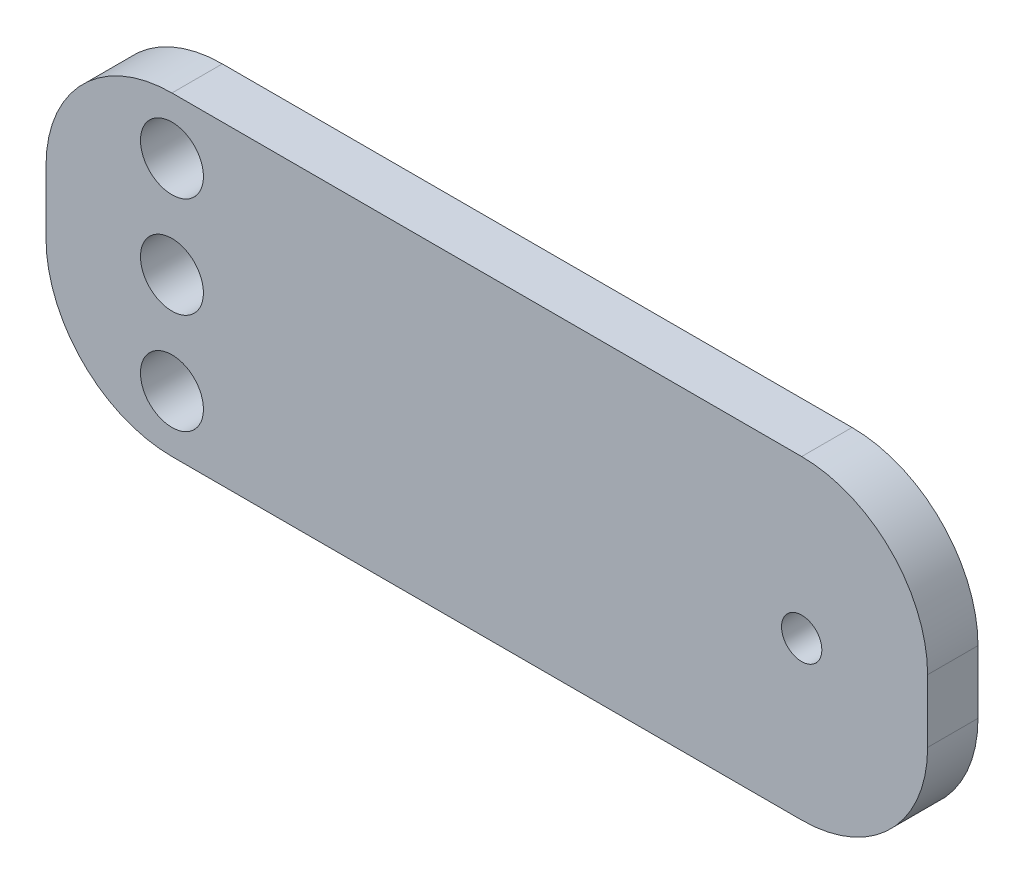
ISO-10303-21;
HEADER;
FILE_DESCRIPTION(('STEP AP214'),'2;1');
FILE_NAME('part.step','',(''),(''),'','','');
FILE_SCHEMA(('AUTOMOTIVE_DESIGN { 1 0 10303 214 1 1 1 1 }'));
ENDSEC;
DATA;
#1=APPLICATION_CONTEXT('core data for automotive mechanical design processes');
#2=APPLICATION_PROTOCOL_DEFINITION('international standard','automotive_design',2000,#1);
#3=PRODUCT_CONTEXT('',#1,'mechanical');
#4=PRODUCT('Part','Part','',(#3));
#5=PRODUCT_RELATED_PRODUCT_CATEGORY('part','',(#4));
#6=PRODUCT_DEFINITION_FORMATION('','',#4);
#7=PRODUCT_DEFINITION_CONTEXT('part definition',#1,'design');
#8=PRODUCT_DEFINITION('design','',#6,#7);
#9=PRODUCT_DEFINITION_SHAPE('','',#8);
#10=(LENGTH_UNIT() NAMED_UNIT(*) SI_UNIT(.MILLI.,.METRE.));
#11=(NAMED_UNIT(*) PLANE_ANGLE_UNIT() SI_UNIT($,.RADIAN.));
#12=(NAMED_UNIT(*) SI_UNIT($,.STERADIAN.) SOLID_ANGLE_UNIT());
#13=UNCERTAINTY_MEASURE_WITH_UNIT(LENGTH_MEASURE(1.E-05),#10,'distance_accuracy_value','');
#14=(GEOMETRIC_REPRESENTATION_CONTEXT(3) GLOBAL_UNCERTAINTY_ASSIGNED_CONTEXT((#13)) GLOBAL_UNIT_ASSIGNED_CONTEXT((#10,
#11,#12)) REPRESENTATION_CONTEXT('',''));
#15=CARTESIAN_POINT('',(0.,0.,0.));
#16=DIRECTION('',(0.,0.,1.));
#17=DIRECTION('',(1.,0.,0.));
#18=AXIS2_PLACEMENT_3D('',#15,#16,#17);
#19=CARTESIAN_POINT('',(0.,0.,4.));
#20=DIRECTION('',(0.,0.,-1.));
#21=DIRECTION('',(-1.,0.,0.));
#22=AXIS2_PLACEMENT_3D('',#19,#20,#21);
#23=PLANE('',#22);
#24=CARTESIAN_POINT('',(-25.,8.,4.));
#25=DIRECTION('',(0.,0.,1.));
#26=DIRECTION('',(1.,0.,0.));
#27=AXIS2_PLACEMENT_3D('',#24,#25,#26);
#28=CIRCLE('',#27,2.5);
#29=CARTESIAN_POINT('',(-22.5,8.,4.));
#30=VERTEX_POINT('',#29);
#31=EDGE_CURVE('E189',#30,#30,#28,.T.);
#32=ORIENTED_EDGE('',*,*,#31,.F.);
#33=EDGE_LOOP('',(#32));
#34=FACE_BOUND('',#33,.T.);
#35=CARTESIAN_POINT('',(-25.,0.,4.));
#36=DIRECTION('',(0.,0.,1.));
#37=DIRECTION('',(1.,0.,0.));
#38=AXIS2_PLACEMENT_3D('',#35,#36,#37);
#39=CIRCLE('',#38,2.5);
#40=CARTESIAN_POINT('',(-22.5,0.,4.));
#41=VERTEX_POINT('',#40);
#42=EDGE_CURVE('E175',#41,#41,#39,.T.);
#43=ORIENTED_EDGE('',*,*,#42,.F.);
#44=EDGE_LOOP('',(#43));
#45=FACE_BOUND('',#44,.T.);
#46=DIRECTION('',(-1.,0.,0.));
#47=VECTOR('',#46,1.);
#48=CARTESIAN_POINT('',(-35.,12.5,4.));
#49=LINE('',#48,#47);
#50=CARTESIAN_POINT('',(25.,12.5,4.));
#51=VERTEX_POINT('',#50);
#52=CARTESIAN_POINT('',(-25.,12.5,4.));
#53=VERTEX_POINT('',#52);
#54=EDGE_CURVE('E170',#51,#53,#49,.T.);
#55=ORIENTED_EDGE('',*,*,#54,.T.);
#56=CARTESIAN_POINT('',(-25.,2.49999999999999,4.));
#57=DIRECTION('',(0.,0.,-1.));
#58=DIRECTION('',(-1.,0.,0.));
#59=AXIS2_PLACEMENT_3D('',#56,#57,#58);
#60=CIRCLE('',#59,10.);
#61=CARTESIAN_POINT('',(-35.,2.49999999999999,4.));
#62=VERTEX_POINT('',#61);
#63=EDGE_CURVE('E151',#53,#62,#60,.F.);
#64=ORIENTED_EDGE('',*,*,#63,.T.);
#65=DIRECTION('',(0.,-1.,0.));
#66=VECTOR('',#65,1.);
#67=CARTESIAN_POINT('',(-35.,-12.5,4.));
#68=LINE('',#67,#66);
#69=CARTESIAN_POINT('',(-35.,-2.49999999999998,4.));
#70=VERTEX_POINT('',#69);
#71=EDGE_CURVE('E121',#62,#70,#68,.T.);
#72=ORIENTED_EDGE('',*,*,#71,.T.);
#73=CARTESIAN_POINT('',(-25.,-2.49999999999999,4.));
#74=DIRECTION('',(0.,0.,-1.));
#75=DIRECTION('',(-1.,0.,0.));
#76=AXIS2_PLACEMENT_3D('',#73,#74,#75);
#77=CIRCLE('',#76,10.);
#78=CARTESIAN_POINT('',(-25.,-12.5,4.));
#79=VERTEX_POINT('',#78);
#80=EDGE_CURVE('E57',#70,#79,#77,.F.);
#81=ORIENTED_EDGE('',*,*,#80,.T.);
#82=DIRECTION('',(1.,0.,0.));
#83=VECTOR('',#82,1.);
#84=CARTESIAN_POINT('',(-35.,-12.5,4.));
#85=LINE('',#84,#83);
#86=CARTESIAN_POINT('',(25.,-12.5,4.));
#87=VERTEX_POINT('',#86);
#88=EDGE_CURVE('E137',#79,#87,#85,.T.);
#89=ORIENTED_EDGE('',*,*,#88,.T.);
#90=CARTESIAN_POINT('',(25.,-2.5,4.));
#91=DIRECTION('',(0.,0.,-1.));
#92=DIRECTION('',(-1.,0.,0.));
#93=AXIS2_PLACEMENT_3D('',#90,#91,#92);
#94=CIRCLE('',#93,10.);
#95=CARTESIAN_POINT('',(35.,-2.5,4.));
#96=VERTEX_POINT('',#95);
#97=EDGE_CURVE('E148',#87,#96,#94,.F.);
#98=ORIENTED_EDGE('',*,*,#97,.T.);
#99=DIRECTION('',(0.,1.,0.));
#100=VECTOR('',#99,1.);
#101=CARTESIAN_POINT('',(35.,-12.5,4.));
#102=LINE('',#101,#100);
#103=CARTESIAN_POINT('',(35.,2.5,4.));
#104=VERTEX_POINT('',#103);
#105=EDGE_CURVE('E131',#96,#104,#102,.T.);
#106=ORIENTED_EDGE('',*,*,#105,.T.);
#107=CARTESIAN_POINT('',(25.,2.5,4.));
#108=DIRECTION('',(0.,0.,-1.));
#109=DIRECTION('',(-1.,0.,0.));
#110=AXIS2_PLACEMENT_3D('',#107,#108,#109);
#111=CIRCLE('',#110,10.);
#112=EDGE_CURVE('E146',#104,#51,#111,.F.);
#113=ORIENTED_EDGE('',*,*,#112,.T.);
#114=EDGE_LOOP('',(#55,#64,#72,#81,#89,#98,#106,#113));
#115=FACE_BOUND('',#114,.T.);
#116=CARTESIAN_POINT('',(25.,0.,4.));
#117=DIRECTION('',(0.,0.,1.));
#118=DIRECTION('',(1.,0.,0.));
#119=AXIS2_PLACEMENT_3D('',#116,#117,#118);
#120=CIRCLE('',#119,1.6);
#121=CARTESIAN_POINT('',(26.6,0.,4.));
#122=VERTEX_POINT('',#121);
#123=EDGE_CURVE('E184',#122,#122,#120,.T.);
#124=ORIENTED_EDGE('',*,*,#123,.F.);
#125=EDGE_LOOP('',(#124));
#126=FACE_BOUND('',#125,.T.);
#127=CARTESIAN_POINT('',(-25.,-8.,4.));
#128=DIRECTION('',(0.,0.,1.));
#129=DIRECTION('',(1.,0.,0.));
#130=AXIS2_PLACEMENT_3D('',#127,#128,#129);
#131=CIRCLE('',#130,2.5);
#132=CARTESIAN_POINT('',(-22.5,-8.,4.));
#133=VERTEX_POINT('',#132);
#134=EDGE_CURVE('E195',#133,#133,#131,.T.);
#135=ORIENTED_EDGE('',*,*,#134,.F.);
#136=EDGE_LOOP('',(#135));
#137=FACE_BOUND('',#136,.T.);
#138=ADVANCED_FACE('F35',(#34,#45,#115,#126,#137),#23,.F.);
#139=CARTESIAN_POINT('',(0.,0.,0.));
#140=DIRECTION('',(0.,0.,-1.));
#141=DIRECTION('',(-1.,0.,0.));
#142=AXIS2_PLACEMENT_3D('',#139,#140,#141);
#143=PLANE('',#142);
#144=CARTESIAN_POINT('',(-25.,8.,0.));
#145=DIRECTION('',(0.,0.,1.));
#146=DIRECTION('',(1.,0.,0.));
#147=AXIS2_PLACEMENT_3D('',#144,#145,#146);
#148=CIRCLE('',#147,2.5);
#149=CARTESIAN_POINT('',(-22.5,8.,0.));
#150=VERTEX_POINT('',#149);
#151=EDGE_CURVE('E192',#150,#150,#148,.T.);
#152=ORIENTED_EDGE('',*,*,#151,.T.);
#153=EDGE_LOOP('',(#152));
#154=FACE_BOUND('',#153,.T.);
#155=CARTESIAN_POINT('',(-25.,0.,0.));
#156=DIRECTION('',(0.,0.,1.));
#157=DIRECTION('',(1.,0.,0.));
#158=AXIS2_PLACEMENT_3D('',#155,#156,#157);
#159=CIRCLE('',#158,2.5);
#160=CARTESIAN_POINT('',(-22.5,0.,0.));
#161=VERTEX_POINT('',#160);
#162=EDGE_CURVE('E177',#161,#161,#159,.T.);
#163=ORIENTED_EDGE('',*,*,#162,.T.);
#164=EDGE_LOOP('',(#163));
#165=FACE_BOUND('',#164,.T.);
#166=DIRECTION('',(0.,-1.,0.));
#167=VECTOR('',#166,1.);
#168=CARTESIAN_POINT('',(-35.,-12.5,0.));
#169=LINE('',#168,#167);
#170=CARTESIAN_POINT('',(-35.,2.49999999999999,0.));
#171=VERTEX_POINT('',#170);
#172=CARTESIAN_POINT('',(-35.,-2.49999999999998,0.));
#173=VERTEX_POINT('',#172);
#174=EDGE_CURVE('E119',#171,#173,#169,.T.);
#175=ORIENTED_EDGE('',*,*,#174,.F.);
#176=CARTESIAN_POINT('',(-25.,2.49999999999999,0.));
#177=DIRECTION('',(0.,0.,-1.));
#178=DIRECTION('',(-1.,0.,0.));
#179=AXIS2_PLACEMENT_3D('',#176,#177,#178);
#180=CIRCLE('',#179,10.);
#181=CARTESIAN_POINT('',(-25.,12.5,0.));
#182=VERTEX_POINT('',#181);
#183=EDGE_CURVE('E102',#171,#182,#180,.T.);
#184=ORIENTED_EDGE('',*,*,#183,.T.);
#185=DIRECTION('',(-1.,0.,0.));
#186=VECTOR('',#185,1.);
#187=CARTESIAN_POINT('',(-35.,12.5,0.));
#188=LINE('',#187,#186);
#189=CARTESIAN_POINT('',(25.,12.5,0.));
#190=VERTEX_POINT('',#189);
#191=EDGE_CURVE('E129',#190,#182,#188,.T.);
#192=ORIENTED_EDGE('',*,*,#191,.F.);
#193=CARTESIAN_POINT('',(25.,2.5,0.));
#194=DIRECTION('',(0.,0.,-1.));
#195=DIRECTION('',(-1.,0.,0.));
#196=AXIS2_PLACEMENT_3D('',#193,#194,#195);
#197=CIRCLE('',#196,10.);
#198=CARTESIAN_POINT('',(35.,2.5,0.));
#199=VERTEX_POINT('',#198);
#200=EDGE_CURVE('E122',#190,#199,#197,.T.);
#201=ORIENTED_EDGE('',*,*,#200,.T.);
#202=DIRECTION('',(0.,1.,0.));
#203=VECTOR('',#202,1.);
#204=CARTESIAN_POINT('',(35.,-12.5,0.));
#205=LINE('',#204,#203);
#206=CARTESIAN_POINT('',(35.,-2.5,0.));
#207=VERTEX_POINT('',#206);
#208=EDGE_CURVE('E133',#207,#199,#205,.T.);
#209=ORIENTED_EDGE('',*,*,#208,.F.);
#210=CARTESIAN_POINT('',(25.,-2.5,0.));
#211=DIRECTION('',(0.,0.,-1.));
#212=DIRECTION('',(-1.,0.,0.));
#213=AXIS2_PLACEMENT_3D('',#210,#211,#212);
#214=CIRCLE('',#213,10.);
#215=CARTESIAN_POINT('',(25.,-12.5,0.));
#216=VERTEX_POINT('',#215);
#217=EDGE_CURVE('E140',#207,#216,#214,.T.);
#218=ORIENTED_EDGE('',*,*,#217,.T.);
#219=DIRECTION('',(1.,0.,0.));
#220=VECTOR('',#219,1.);
#221=CARTESIAN_POINT('',(-35.,-12.5,0.));
#222=LINE('',#221,#220);
#223=CARTESIAN_POINT('',(-25.,-12.5,0.));
#224=VERTEX_POINT('',#223);
#225=EDGE_CURVE('E128',#224,#216,#222,.T.);
#226=ORIENTED_EDGE('',*,*,#225,.F.);
#227=CARTESIAN_POINT('',(-25.,-2.49999999999999,0.));
#228=DIRECTION('',(0.,0.,-1.));
#229=DIRECTION('',(-1.,0.,0.));
#230=AXIS2_PLACEMENT_3D('',#227,#228,#229);
#231=CIRCLE('',#230,10.);
#232=EDGE_CURVE('E113',#224,#173,#231,.T.);
#233=ORIENTED_EDGE('',*,*,#232,.T.);
#234=EDGE_LOOP('',(#175,#184,#192,#201,#209,#218,#226,#233));
#235=FACE_BOUND('',#234,.T.);
#236=CARTESIAN_POINT('',(25.,0.,0.));
#237=DIRECTION('',(0.,0.,1.));
#238=DIRECTION('',(1.,0.,0.));
#239=AXIS2_PLACEMENT_3D('',#236,#237,#238);
#240=CIRCLE('',#239,1.6);
#241=CARTESIAN_POINT('',(26.6,0.,0.));
#242=VERTEX_POINT('',#241);
#243=EDGE_CURVE('E186',#242,#242,#240,.T.);
#244=ORIENTED_EDGE('',*,*,#243,.T.);
#245=EDGE_LOOP('',(#244));
#246=FACE_BOUND('',#245,.T.);
#247=CARTESIAN_POINT('',(-25.,-8.,0.));
#248=DIRECTION('',(0.,0.,1.));
#249=DIRECTION('',(1.,0.,0.));
#250=AXIS2_PLACEMENT_3D('',#247,#248,#249);
#251=CIRCLE('',#250,2.5);
#252=CARTESIAN_POINT('',(-22.5,-8.,0.));
#253=VERTEX_POINT('',#252);
#254=EDGE_CURVE('E198',#253,#253,#251,.T.);
#255=ORIENTED_EDGE('',*,*,#254,.T.);
#256=EDGE_LOOP('',(#255));
#257=FACE_BOUND('',#256,.T.);
#258=ADVANCED_FACE('F125',(#154,#165,#235,#246,#257),#143,.T.);
#259=CARTESIAN_POINT('',(35.,-12.5,4.));
#260=DIRECTION('',(-1.,0.,0.));
#261=DIRECTION('',(0.,0.,1.));
#262=AXIS2_PLACEMENT_3D('',#259,#260,#261);
#263=PLANE('',#262);
#264=ORIENTED_EDGE('',*,*,#105,.F.);
#265=DIRECTION('',(0.,0.,-1.));
#266=VECTOR('',#265,1.);
#267=CARTESIAN_POINT('',(35.,-2.5,4.));
#268=LINE('',#267,#266);
#269=EDGE_CURVE('E11',#96,#207,#268,.T.);
#270=ORIENTED_EDGE('',*,*,#269,.T.);
#271=ORIENTED_EDGE('',*,*,#208,.T.);
#272=DIRECTION('',(0.,0.,-1.));
#273=VECTOR('',#272,1.);
#274=CARTESIAN_POINT('',(35.,2.5,4.));
#275=LINE('',#274,#273);
#276=EDGE_CURVE('E43',#199,#104,#275,.F.);
#277=ORIENTED_EDGE('',*,*,#276,.T.);
#278=EDGE_LOOP('',(#264,#270,#271,#277));
#279=FACE_BOUND('',#278,.T.);
#280=ADVANCED_FACE('F161',(#279),#263,.F.);
#281=CARTESIAN_POINT('',(-35.,12.5,4.));
#282=DIRECTION('',(0.,-1.,0.));
#283=DIRECTION('',(1.,0.,0.));
#284=AXIS2_PLACEMENT_3D('',#281,#282,#283);
#285=PLANE('',#284);
#286=ORIENTED_EDGE('',*,*,#191,.T.);
#287=DIRECTION('',(0.,0.,-1.));
#288=VECTOR('',#287,1.);
#289=CARTESIAN_POINT('',(-25.,12.5,4.));
#290=LINE('',#289,#288);
#291=EDGE_CURVE('E107',#182,#53,#290,.F.);
#292=ORIENTED_EDGE('',*,*,#291,.T.);
#293=ORIENTED_EDGE('',*,*,#54,.F.);
#294=DIRECTION('',(0.,0.,-1.));
#295=VECTOR('',#294,1.);
#296=CARTESIAN_POINT('',(25.,12.5,4.));
#297=LINE('',#296,#295);
#298=EDGE_CURVE('E112',#51,#190,#297,.T.);
#299=ORIENTED_EDGE('',*,*,#298,.T.);
#300=EDGE_LOOP('',(#286,#292,#293,#299));
#301=FACE_BOUND('',#300,.T.);
#302=ADVANCED_FACE('F174',(#301),#285,.F.);
#303=CARTESIAN_POINT('',(-35.,-12.5,4.));
#304=DIRECTION('',(1.,0.,0.));
#305=DIRECTION('',(0.,0.,-1.));
#306=AXIS2_PLACEMENT_3D('',#303,#304,#305);
#307=PLANE('',#306);
#308=ORIENTED_EDGE('',*,*,#71,.F.);
#309=DIRECTION('',(0.,0.,-1.));
#310=VECTOR('',#309,1.);
#311=CARTESIAN_POINT('',(-35.,2.49999999999999,4.));
#312=LINE('',#311,#310);
#313=EDGE_CURVE('E106',#62,#171,#312,.T.);
#314=ORIENTED_EDGE('',*,*,#313,.T.);
#315=ORIENTED_EDGE('',*,*,#174,.T.);
#316=DIRECTION('',(0.,0.,-1.));
#317=VECTOR('',#316,1.);
#318=CARTESIAN_POINT('',(-35.,-2.49999999999998,4.));
#319=LINE('',#318,#317);
#320=EDGE_CURVE('E123',#173,#70,#319,.F.);
#321=ORIENTED_EDGE('',*,*,#320,.T.);
#322=EDGE_LOOP('',(#308,#314,#315,#321));
#323=FACE_BOUND('',#322,.T.);
#324=ADVANCED_FACE('F118',(#323),#307,.F.);
#325=CARTESIAN_POINT('',(-35.,-12.5,4.));
#326=DIRECTION('',(0.,1.,0.));
#327=DIRECTION('',(-1.,0.,0.));
#328=AXIS2_PLACEMENT_3D('',#325,#326,#327);
#329=PLANE('',#328);
#330=ORIENTED_EDGE('',*,*,#88,.F.);
#331=DIRECTION('',(0.,0.,-1.));
#332=VECTOR('',#331,1.);
#333=CARTESIAN_POINT('',(-25.,-12.5,4.));
#334=LINE('',#333,#332);
#335=EDGE_CURVE('E154',#79,#224,#334,.T.);
#336=ORIENTED_EDGE('',*,*,#335,.T.);
#337=ORIENTED_EDGE('',*,*,#225,.T.);
#338=DIRECTION('',(0.,0.,-1.));
#339=VECTOR('',#338,1.);
#340=CARTESIAN_POINT('',(25.,-12.5,4.));
#341=LINE('',#340,#339);
#342=EDGE_CURVE('E50',#216,#87,#341,.F.);
#343=ORIENTED_EDGE('',*,*,#342,.T.);
#344=EDGE_LOOP('',(#330,#336,#337,#343));
#345=FACE_BOUND('',#344,.T.);
#346=ADVANCED_FACE('F221',(#345),#329,.F.);
#347=CARTESIAN_POINT('',(-25.,0.,4.));
#348=DIRECTION('',(0.,0.,-1.));
#349=DIRECTION('',(-1.,0.,0.));
#350=AXIS2_PLACEMENT_3D('',#347,#348,#349);
#351=CYLINDRICAL_SURFACE('',#350,2.5);
#352=ORIENTED_EDGE('',*,*,#42,.T.);
#353=EDGE_LOOP('',(#352));
#354=FACE_BOUND('',#353,.T.);
#355=ORIENTED_EDGE('',*,*,#162,.F.);
#356=EDGE_LOOP('',(#355));
#357=FACE_BOUND('',#356,.T.);
#358=ADVANCED_FACE('F218',(#354,#357),#351,.F.);
#359=CARTESIAN_POINT('',(25.,0.,4.));
#360=DIRECTION('',(0.,0.,-1.));
#361=DIRECTION('',(-1.,0.,0.));
#362=AXIS2_PLACEMENT_3D('',#359,#360,#361);
#363=CYLINDRICAL_SURFACE('',#362,1.6);
#364=ORIENTED_EDGE('',*,*,#123,.T.);
#365=EDGE_LOOP('',(#364));
#366=FACE_BOUND('',#365,.T.);
#367=ORIENTED_EDGE('',*,*,#243,.F.);
#368=EDGE_LOOP('',(#367));
#369=FACE_BOUND('',#368,.T.);
#370=ADVANCED_FACE('F313',(#366,#369),#363,.F.);
#371=CARTESIAN_POINT('',(-25.,8.,4.));
#372=DIRECTION('',(0.,0.,-1.));
#373=DIRECTION('',(-1.,0.,0.));
#374=AXIS2_PLACEMENT_3D('',#371,#372,#373);
#375=CYLINDRICAL_SURFACE('',#374,2.5);
#376=ORIENTED_EDGE('',*,*,#31,.T.);
#377=EDGE_LOOP('',(#376));
#378=FACE_BOUND('',#377,.T.);
#379=ORIENTED_EDGE('',*,*,#151,.F.);
#380=EDGE_LOOP('',(#379));
#381=FACE_BOUND('',#380,.T.);
#382=ADVANCED_FACE('F304',(#378,#381),#375,.F.);
#383=CARTESIAN_POINT('',(-25.,-8.,4.));
#384=DIRECTION('',(0.,0.,-1.));
#385=DIRECTION('',(-1.,0.,0.));
#386=AXIS2_PLACEMENT_3D('',#383,#384,#385);
#387=CYLINDRICAL_SURFACE('',#386,2.5);
#388=ORIENTED_EDGE('',*,*,#134,.T.);
#389=EDGE_LOOP('',(#388));
#390=FACE_BOUND('',#389,.T.);
#391=ORIENTED_EDGE('',*,*,#254,.F.);
#392=EDGE_LOOP('',(#391));
#393=FACE_BOUND('',#392,.T.);
#394=ADVANCED_FACE('F204',(#390,#393),#387,.F.);
#395=CARTESIAN_POINT('',(-25.,2.49999999999999,4.));
#396=DIRECTION('',(0.,0.,-1.));
#397=DIRECTION('',(-1.,0.,0.));
#398=AXIS2_PLACEMENT_3D('',#395,#396,#397);
#399=CYLINDRICAL_SURFACE('',#398,10.);
#400=ORIENTED_EDGE('',*,*,#63,.F.);
#401=ORIENTED_EDGE('',*,*,#291,.F.);
#402=ORIENTED_EDGE('',*,*,#183,.F.);
#403=ORIENTED_EDGE('',*,*,#313,.F.);
#404=EDGE_LOOP('',(#400,#401,#402,#403));
#405=FACE_BOUND('',#404,.T.);
#406=ADVANCED_FACE('F105',(#405),#399,.T.);
#407=CARTESIAN_POINT('',(-25.,-2.49999999999999,4.));
#408=DIRECTION('',(0.,0.,-1.));
#409=DIRECTION('',(-1.,0.,0.));
#410=AXIS2_PLACEMENT_3D('',#407,#408,#409);
#411=CYLINDRICAL_SURFACE('',#410,10.);
#412=ORIENTED_EDGE('',*,*,#80,.F.);
#413=ORIENTED_EDGE('',*,*,#320,.F.);
#414=ORIENTED_EDGE('',*,*,#232,.F.);
#415=ORIENTED_EDGE('',*,*,#335,.F.);
#416=EDGE_LOOP('',(#412,#413,#414,#415));
#417=FACE_BOUND('',#416,.T.);
#418=ADVANCED_FACE('F232',(#417),#411,.T.);
#419=CARTESIAN_POINT('',(25.,-2.5,4.));
#420=DIRECTION('',(0.,0.,-1.));
#421=DIRECTION('',(-1.,0.,0.));
#422=AXIS2_PLACEMENT_3D('',#419,#420,#421);
#423=CYLINDRICAL_SURFACE('',#422,10.);
#424=ORIENTED_EDGE('',*,*,#97,.F.);
#425=ORIENTED_EDGE('',*,*,#342,.F.);
#426=ORIENTED_EDGE('',*,*,#217,.F.);
#427=ORIENTED_EDGE('',*,*,#269,.F.);
#428=EDGE_LOOP('',(#424,#425,#426,#427));
#429=FACE_BOUND('',#428,.T.);
#430=ADVANCED_FACE('F234',(#429),#423,.T.);
#431=CARTESIAN_POINT('',(25.,2.5,4.));
#432=DIRECTION('',(0.,0.,-1.));
#433=DIRECTION('',(-1.,0.,0.));
#434=AXIS2_PLACEMENT_3D('',#431,#432,#433);
#435=CYLINDRICAL_SURFACE('',#434,10.);
#436=ORIENTED_EDGE('',*,*,#112,.F.);
#437=ORIENTED_EDGE('',*,*,#276,.F.);
#438=ORIENTED_EDGE('',*,*,#200,.F.);
#439=ORIENTED_EDGE('',*,*,#298,.F.);
#440=EDGE_LOOP('',(#436,#437,#438,#439));
#441=FACE_BOUND('',#440,.T.);
#442=ADVANCED_FACE('F37',(#441),#435,.T.);
#443=CLOSED_SHELL('',(#138,#258,#280,#302,#324,#346,#358,#370,#382,#394,#406,#418,#430,#442));
#444=MANIFOLD_SOLID_BREP('B2',#443);
#445=ADVANCED_BREP_SHAPE_REPRESENTATION('',(#18,#444),#14);
#446=SHAPE_DEFINITION_REPRESENTATION(#9,#445);
ENDSEC;
END-ISO-10303-21;
